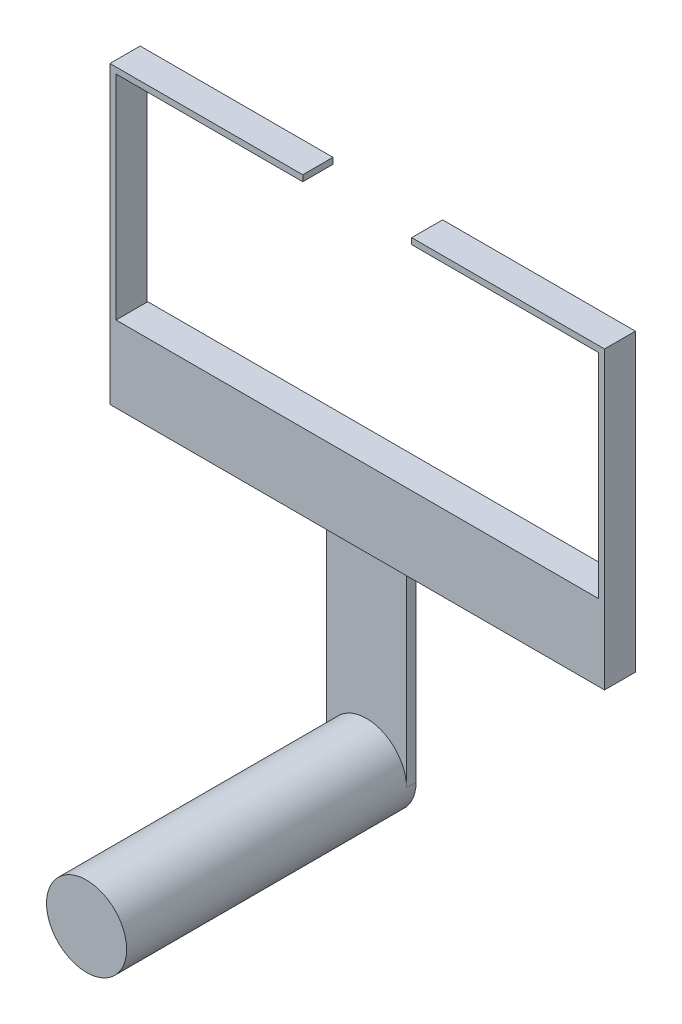
ISO-10303-21;
HEADER;
FILE_DESCRIPTION(('STEP AP214'),'2;1');
FILE_NAME('part.step','',(''),(''),'','','');
FILE_SCHEMA(('AUTOMOTIVE_DESIGN { 1 0 10303 214 1 1 1 1 }'));
ENDSEC;
DATA;
#1=APPLICATION_CONTEXT('core data for automotive mechanical design processes');
#2=APPLICATION_PROTOCOL_DEFINITION('international standard','automotive_design',2000,#1);
#3=PRODUCT_CONTEXT('',#1,'mechanical');
#4=PRODUCT('Part','Part','',(#3));
#5=PRODUCT_RELATED_PRODUCT_CATEGORY('part','',(#4));
#6=PRODUCT_DEFINITION_FORMATION('','',#4);
#7=PRODUCT_DEFINITION_CONTEXT('part definition',#1,'design');
#8=PRODUCT_DEFINITION('design','',#6,#7);
#9=PRODUCT_DEFINITION_SHAPE('','',#8);
#10=(LENGTH_UNIT() NAMED_UNIT(*) SI_UNIT(.MILLI.,.METRE.));
#11=(NAMED_UNIT(*) PLANE_ANGLE_UNIT() SI_UNIT($,.RADIAN.));
#12=(NAMED_UNIT(*) SI_UNIT($,.STERADIAN.) SOLID_ANGLE_UNIT());
#13=UNCERTAINTY_MEASURE_WITH_UNIT(LENGTH_MEASURE(1.E-05),#10,'distance_accuracy_value','');
#14=(GEOMETRIC_REPRESENTATION_CONTEXT(3) GLOBAL_UNCERTAINTY_ASSIGNED_CONTEXT((#13)) GLOBAL_UNIT_ASSIGNED_CONTEXT((#10,
#11,#12)) REPRESENTATION_CONTEXT('',''));
#15=CARTESIAN_POINT('',(0.,0.,0.));
#16=DIRECTION('',(0.,0.,1.));
#17=DIRECTION('',(1.,0.,0.));
#18=AXIS2_PLACEMENT_3D('',#15,#16,#17);
#19=CARTESIAN_POINT('',(0.,0.,-38.1));
#20=DIRECTION('',(0.,0.,1.));
#21=DIRECTION('',(1.,0.,0.));
#22=AXIS2_PLACEMENT_3D('',#19,#20,#21);
#23=CYLINDRICAL_SURFACE('',#22,5.27040746730455);
#24=DIRECTION('',(0.,0.,-1.));
#25=VECTOR('',#24,1.);
#26=CARTESIAN_POINT('',(5.27040746730455,0.,-36.8531804156065));
#27=LINE('',#26,#25);
#28=CARTESIAN_POINT('',(5.27040746730455,0.,-36.8531804156065));
#29=VERTEX_POINT('',#28);
#30=CARTESIAN_POINT('',(5.27040746730455,0.,-38.1));
#31=VERTEX_POINT('',#30);
#32=EDGE_CURVE('E406',#29,#31,#27,.T.);
#33=ORIENTED_EDGE('',*,*,#32,.F.);
#34=CARTESIAN_POINT('',(0.,0.,-36.8531804156065));
#35=DIRECTION('',(0.,0.,1.));
#36=DIRECTION('',(1.,0.,0.));
#37=AXIS2_PLACEMENT_3D('',#34,#35,#36);
#38=CIRCLE('',#37,5.27040746730455);
#39=CARTESIAN_POINT('',(-5.27040746730455,0.,-36.8531804156065));
#40=VERTEX_POINT('',#39);
#41=EDGE_CURVE('E79',#40,#29,#38,.F.);
#42=ORIENTED_EDGE('',*,*,#41,.F.);
#43=DIRECTION('',(0.,0.,-1.));
#44=VECTOR('',#43,1.);
#45=CARTESIAN_POINT('',(-5.27040746730455,0.,-36.8531804156065));
#46=LINE('',#45,#44);
#47=CARTESIAN_POINT('',(-5.27040746730455,0.,-38.1));
#48=VERTEX_POINT('',#47);
#49=EDGE_CURVE('E424',#40,#48,#46,.T.);
#50=ORIENTED_EDGE('',*,*,#49,.T.);
#51=CARTESIAN_POINT('',(0.,0.,-38.1));
#52=DIRECTION('',(0.,0.,1.));
#53=DIRECTION('',(1.,0.,0.));
#54=AXIS2_PLACEMENT_3D('',#51,#52,#53);
#55=CIRCLE('',#54,5.27040746730455);
#56=EDGE_CURVE('E431',#48,#31,#55,.T.);
#57=ORIENTED_EDGE('',*,*,#56,.T.);
#58=EDGE_LOOP('',(#33,#42,#50,#57));
#59=FACE_BOUND('',#58,.T.);
#60=CARTESIAN_POINT('',(0.,0.,0.));
#61=DIRECTION('',(0.,0.,1.));
#62=DIRECTION('',(1.,0.,0.));
#63=AXIS2_PLACEMENT_3D('',#60,#61,#62);
#64=CIRCLE('',#63,5.27040746730455);
#65=CARTESIAN_POINT('',(5.27040746730455,0.,0.));
#66=VERTEX_POINT('',#65);
#67=EDGE_CURVE('E423',#66,#66,#64,.T.);
#68=ORIENTED_EDGE('',*,*,#67,.F.);
#69=EDGE_LOOP('',(#68));
#70=FACE_BOUND('',#69,.T.);
#71=ADVANCED_FACE('F77',(#59,#70),#23,.T.);
#72=CARTESIAN_POINT('',(0.,0.,-38.1));
#73=DIRECTION('',(0.,0.,1.));
#74=DIRECTION('',(1.,0.,0.));
#75=AXIS2_PLACEMENT_3D('',#72,#73,#74);
#76=PLANE('',#75);
#77=ORIENTED_EDGE('',*,*,#56,.F.);
#78=DIRECTION('',(0.,1.,0.));
#79=VECTOR('',#78,1.);
#80=CARTESIAN_POINT('',(-5.27040746730455,0.,-38.1));
#81=LINE('',#80,#79);
#82=CARTESIAN_POINT('',(-5.27040746730455,25.4,-38.1));
#83=VERTEX_POINT('',#82);
#84=EDGE_CURVE('E412',#48,#83,#81,.T.);
#85=ORIENTED_EDGE('',*,*,#84,.T.);
#86=DIRECTION('',(1.,0.,0.));
#87=VECTOR('',#86,1.);
#88=CARTESIAN_POINT('',(5.27040746730455,25.4,-38.1));
#89=LINE('',#88,#87);
#90=CARTESIAN_POINT('',(5.27040746730455,25.4,-38.1));
#91=VERTEX_POINT('',#90);
#92=EDGE_CURVE('E400',#83,#91,#89,.T.);
#93=ORIENTED_EDGE('',*,*,#92,.T.);
#94=DIRECTION('',(0.,-1.,0.));
#95=VECTOR('',#94,1.);
#96=CARTESIAN_POINT('',(5.27040746730455,0.,-38.1));
#97=LINE('',#96,#95);
#98=EDGE_CURVE('E391',#91,#31,#97,.T.);
#99=ORIENTED_EDGE('',*,*,#98,.T.);
#100=EDGE_LOOP('',(#77,#85,#93,#99));
#101=FACE_BOUND('',#100,.T.);
#102=ADVANCED_FACE('F441',(#101),#76,.F.);
#103=CARTESIAN_POINT('',(0.,0.,0.));
#104=DIRECTION('',(0.,0.,1.));
#105=DIRECTION('',(1.,0.,0.));
#106=AXIS2_PLACEMENT_3D('',#103,#104,#105);
#107=PLANE('',#106);
#108=ORIENTED_EDGE('',*,*,#67,.T.);
#109=EDGE_LOOP('',(#108));
#110=FACE_BOUND('',#109,.T.);
#111=ADVANCED_FACE('F438',(#110),#107,.T.);
#112=CARTESIAN_POINT('',(5.27040746730455,0.,-36.8531804156065));
#113=DIRECTION('',(1.,0.,0.));
#114=DIRECTION('',(0.,0.,-1.));
#115=AXIS2_PLACEMENT_3D('',#112,#113,#114);
#116=PLANE('',#115);
#117=ORIENTED_EDGE('',*,*,#98,.F.);
#118=DIRECTION('',(0.,0.,-1.));
#119=VECTOR('',#118,1.);
#120=CARTESIAN_POINT('',(5.27040746730455,25.4,-36.8531804156065));
#121=LINE('',#120,#119);
#122=CARTESIAN_POINT('',(5.27040746730455,25.4,-36.8531804156065));
#123=VERTEX_POINT('',#122);
#124=EDGE_CURVE('E417',#123,#91,#121,.T.);
#125=ORIENTED_EDGE('',*,*,#124,.F.);
#126=DIRECTION('',(0.,-1.,0.));
#127=VECTOR('',#126,1.);
#128=CARTESIAN_POINT('',(5.27040746730455,0.,-36.8531804156065));
#129=LINE('',#128,#127);
#130=EDGE_CURVE('E393',#123,#29,#129,.T.);
#131=ORIENTED_EDGE('',*,*,#130,.T.);
#132=ORIENTED_EDGE('',*,*,#32,.T.);
#133=EDGE_LOOP('',(#117,#125,#131,#132));
#134=FACE_BOUND('',#133,.T.);
#135=ADVANCED_FACE('F458',(#134),#116,.T.);
#136=CARTESIAN_POINT('',(-5.27040746730455,0.,-36.8531804156065));
#137=DIRECTION('',(-1.,0.,0.));
#138=DIRECTION('',(0.,0.,1.));
#139=AXIS2_PLACEMENT_3D('',#136,#137,#138);
#140=PLANE('',#139);
#141=ORIENTED_EDGE('',*,*,#84,.F.);
#142=ORIENTED_EDGE('',*,*,#49,.F.);
#143=DIRECTION('',(0.,1.,0.));
#144=VECTOR('',#143,1.);
#145=CARTESIAN_POINT('',(-5.27040746730455,0.,-36.8531804156065));
#146=LINE('',#145,#144);
#147=CARTESIAN_POINT('',(-5.27040746730455,25.4,-36.8531804156065));
#148=VERTEX_POINT('',#147);
#149=EDGE_CURVE('E398',#40,#148,#146,.T.);
#150=ORIENTED_EDGE('',*,*,#149,.T.);
#151=DIRECTION('',(0.,0.,-1.));
#152=VECTOR('',#151,1.);
#153=CARTESIAN_POINT('',(-5.27040746730455,25.4,-36.8531804156065));
#154=LINE('',#153,#152);
#155=EDGE_CURVE('E422',#148,#83,#154,.T.);
#156=ORIENTED_EDGE('',*,*,#155,.T.);
#157=EDGE_LOOP('',(#141,#142,#150,#156));
#158=FACE_BOUND('',#157,.T.);
#159=ADVANCED_FACE('F466',(#158),#140,.T.);
#160=CARTESIAN_POINT('',(0.,0.,-36.8531804156065));
#161=DIRECTION('',(0.,0.,1.));
#162=DIRECTION('',(1.,0.,0.));
#163=AXIS2_PLACEMENT_3D('',#160,#161,#162);
#164=PLANE('',#163);
#165=ORIENTED_EDGE('',*,*,#149,.F.);
#166=ORIENTED_EDGE('',*,*,#41,.T.);
#167=ORIENTED_EDGE('',*,*,#130,.F.);
#168=DIRECTION('',(1.,0.,0.));
#169=VECTOR('',#168,1.);
#170=CARTESIAN_POINT('',(5.27040746730455,25.4,-36.8531804156065));
#171=LINE('',#170,#169);
#172=EDGE_CURVE('E401',#148,#123,#171,.T.);
#173=ORIENTED_EDGE('',*,*,#172,.F.);
#174=EDGE_LOOP('',(#165,#166,#167,#173));
#175=FACE_BOUND('',#174,.T.);
#176=ADVANCED_FACE('F460',(#175),#164,.T.);
#177=CARTESIAN_POINT('',(-31.75,35.427755954177,-35.6271272209921));
#178=DIRECTION('',(1.,0.,0.));
#179=DIRECTION('',(0.,0.,-1.));
#180=AXIS2_PLACEMENT_3D('',#177,#178,#179);
#181=PLANE('',#180);
#182=DIRECTION('',(0.,0.,1.));
#183=VECTOR('',#182,1.);
#184=CARTESIAN_POINT('',(-31.75,25.4,-35.6271272209921));
#185=LINE('',#184,#183);
#186=CARTESIAN_POINT('',(-31.75,25.4,-39.8007127790079));
#187=VERTEX_POINT('',#186);
#188=CARTESIAN_POINT('',(-31.75,25.4,-39.6911272209921));
#189=VERTEX_POINT('',#188);
#190=EDGE_CURVE('E329',#187,#189,#185,.T.);
#191=ORIENTED_EDGE('',*,*,#190,.T.);
#192=DIRECTION('',(0.,1.,0.));
#193=VECTOR('',#192,1.);
#194=CARTESIAN_POINT('',(-31.75,25.4,-39.6911272209921));
#195=LINE('',#194,#193);
#196=CARTESIAN_POINT('',(-31.75,35.427755954177,-39.6911272209921));
#197=VERTEX_POINT('',#196);
#198=EDGE_CURVE('E306',#189,#197,#195,.T.);
#199=ORIENTED_EDGE('',*,*,#198,.T.);
#200=DIRECTION('',(0.,0.,1.));
#201=VECTOR('',#200,1.);
#202=CARTESIAN_POINT('',(-31.75,35.427755954177,-35.6271272209921));
#203=LINE('',#202,#201);
#204=CARTESIAN_POINT('',(-31.75,35.427755954177,-39.8007127790079));
#205=VERTEX_POINT('',#204);
#206=EDGE_CURVE('E357',#205,#197,#203,.T.);
#207=ORIENTED_EDGE('',*,*,#206,.F.);
#208=DIRECTION('',(0.,-1.,0.));
#209=VECTOR('',#208,1.);
#210=CARTESIAN_POINT('',(-31.75,35.427755954177,-39.8007127790079));
#211=LINE('',#210,#209);
#212=EDGE_CURVE('E372',#205,#187,#211,.T.);
#213=ORIENTED_EDGE('',*,*,#212,.T.);
#214=EDGE_LOOP('',(#191,#199,#207,#213));
#215=FACE_BOUND('',#214,.T.);
#216=ADVANCED_FACE('F472',(#215),#181,.F.);
#217=CARTESIAN_POINT('',(31.75,35.427755954177,-35.6271272209921));
#218=DIRECTION('',(0.,0.,-1.));
#219=DIRECTION('',(-1.,0.,0.));
#220=AXIS2_PLACEMENT_3D('',#217,#218,#219);
#221=PLANE('',#220);
#222=DIRECTION('',(1.,0.,0.));
#223=VECTOR('',#222,1.);
#224=CARTESIAN_POINT('',(31.75,25.4,-35.6271272209921));
#225=LINE('',#224,#223);
#226=CARTESIAN_POINT('',(-32.5502280965126,25.4,-35.6271272209921));
#227=VERTEX_POINT('',#226);
#228=CARTESIAN_POINT('',(32.5502280965125,25.4,-35.6271272209921));
#229=VERTEX_POINT('',#228);
#230=EDGE_CURVE('E377',#227,#229,#225,.T.);
#231=ORIENTED_EDGE('',*,*,#230,.T.);
#232=DIRECTION('',(0.,1.,0.));
#233=VECTOR('',#232,1.);
#234=CARTESIAN_POINT('',(32.5502280965125,25.4,-35.6271272209921));
#235=LINE('',#234,#233);
#236=CARTESIAN_POINT('',(32.5502280965125,64.2748280965126,-35.6271272209921));
#237=VERTEX_POINT('',#236);
#238=EDGE_CURVE('E345',#229,#237,#235,.T.);
#239=ORIENTED_EDGE('',*,*,#238,.T.);
#240=DIRECTION('',(1.,0.,0.));
#241=VECTOR('',#240,1.);
#242=CARTESIAN_POINT('',(32.5502280965125,64.2748280965126,-35.6271272209921));
#243=LINE('',#242,#241);
#244=CARTESIAN_POINT('',(7.1705480965125,64.2748280965126,-35.6271272209921));
#245=VERTEX_POINT('',#244);
#246=EDGE_CURVE('E284',#245,#237,#243,.T.);
#247=ORIENTED_EDGE('',*,*,#246,.F.);
#248=DIRECTION('',(0.,-1.,0.));
#249=VECTOR('',#248,1.);
#250=CARTESIAN_POINT('',(7.1705480965125,64.2748280965126,-35.6271272209921));
#251=LINE('',#250,#249);
#252=CARTESIAN_POINT('',(7.1705480965125,63.4746,-35.6271272209921));
#253=VERTEX_POINT('',#252);
#254=EDGE_CURVE('E278',#245,#253,#251,.T.);
#255=ORIENTED_EDGE('',*,*,#254,.T.);
#256=DIRECTION('',(1.,0.,0.));
#257=VECTOR('',#256,1.);
#258=CARTESIAN_POINT('',(32.5502280965125,63.4746,-35.6271272209921));
#259=LINE('',#258,#257);
#260=CARTESIAN_POINT('',(31.75,63.4746,-35.6271272209921));
#261=VERTEX_POINT('',#260);
#262=EDGE_CURVE('E281',#253,#261,#259,.T.);
#263=ORIENTED_EDGE('',*,*,#262,.T.);
#264=DIRECTION('',(0.,-1.,0.));
#265=VECTOR('',#264,1.);
#266=CARTESIAN_POINT('',(31.75,25.4,-35.6271272209921));
#267=LINE('',#266,#265);
#268=CARTESIAN_POINT('',(31.75,35.427755954177,-35.6271272209921));
#269=VERTEX_POINT('',#268);
#270=EDGE_CURVE('E323',#261,#269,#267,.T.);
#271=ORIENTED_EDGE('',*,*,#270,.T.);
#272=DIRECTION('',(1.,0.,0.));
#273=VECTOR('',#272,1.);
#274=CARTESIAN_POINT('',(31.75,35.427755954177,-35.6271272209921));
#275=LINE('',#274,#273);
#276=CARTESIAN_POINT('',(-31.75,35.427755954177,-35.6271272209921));
#277=VERTEX_POINT('',#276);
#278=EDGE_CURVE('E363',#277,#269,#275,.T.);
#279=ORIENTED_EDGE('',*,*,#278,.F.);
#280=DIRECTION('',(0.,1.,0.));
#281=VECTOR('',#280,1.);
#282=CARTESIAN_POINT('',(-31.75,25.4,-35.6271272209921));
#283=LINE('',#282,#281);
#284=CARTESIAN_POINT('',(-31.75,63.4746,-35.6271272209921));
#285=VERTEX_POINT('',#284);
#286=EDGE_CURVE('E229',#277,#285,#283,.T.);
#287=ORIENTED_EDGE('',*,*,#286,.T.);
#288=DIRECTION('',(1.,0.,0.));
#289=VECTOR('',#288,1.);
#290=CARTESIAN_POINT('',(-32.5502280965126,63.4746,-35.6271272209921));
#291=LINE('',#290,#289);
#292=CARTESIAN_POINT('',(-7.17054809651258,63.4746,-35.6271272209921));
#293=VERTEX_POINT('',#292);
#294=EDGE_CURVE('E258',#285,#293,#291,.T.);
#295=ORIENTED_EDGE('',*,*,#294,.T.);
#296=DIRECTION('',(0.,-1.,0.));
#297=VECTOR('',#296,1.);
#298=CARTESIAN_POINT('',(-7.17054809651258,64.2748280965126,-35.6271272209921));
#299=LINE('',#298,#297);
#300=CARTESIAN_POINT('',(-7.17054809651258,64.2748280965126,-35.6271272209921));
#301=VERTEX_POINT('',#300);
#302=EDGE_CURVE('E236',#301,#293,#299,.T.);
#303=ORIENTED_EDGE('',*,*,#302,.F.);
#304=DIRECTION('',(1.,0.,0.));
#305=VECTOR('',#304,1.);
#306=CARTESIAN_POINT('',(-32.5502280965126,64.2748280965126,-35.6271272209921));
#307=LINE('',#306,#305);
#308=CARTESIAN_POINT('',(-32.5502280965126,64.2748280965126,-35.6271272209921));
#309=VERTEX_POINT('',#308);
#310=EDGE_CURVE('E231',#309,#301,#307,.T.);
#311=ORIENTED_EDGE('',*,*,#310,.F.);
#312=DIRECTION('',(0.,-1.,0.));
#313=VECTOR('',#312,1.);
#314=CARTESIAN_POINT('',(-32.5502280965126,25.4,-35.6271272209921));
#315=LINE('',#314,#313);
#316=EDGE_CURVE('E218',#309,#227,#315,.T.);
#317=ORIENTED_EDGE('',*,*,#316,.T.);
#318=EDGE_LOOP('',(#231,#239,#247,#255,#263,#271,#279,#287,#295,#303,#311,#317));
#319=FACE_BOUND('',#318,.T.);
#320=ADVANCED_FACE('F234',(#319),#221,.F.);
#321=CARTESIAN_POINT('',(31.75,35.427755954177,-35.6271272209921));
#322=DIRECTION('',(-1.,0.,0.));
#323=DIRECTION('',(0.,0.,1.));
#324=AXIS2_PLACEMENT_3D('',#321,#322,#323);
#325=PLANE('',#324);
#326=DIRECTION('',(0.,0.,-1.));
#327=VECTOR('',#326,1.);
#328=CARTESIAN_POINT('',(31.75,35.427755954177,-35.6271272209921));
#329=LINE('',#328,#327);
#330=CARTESIAN_POINT('',(31.75,35.427755954177,-39.6911272209921));
#331=VERTEX_POINT('',#330);
#332=CARTESIAN_POINT('',(31.75,35.427755954177,-39.8007127790079));
#333=VERTEX_POINT('',#332);
#334=EDGE_CURVE('E366',#331,#333,#329,.T.);
#335=ORIENTED_EDGE('',*,*,#334,.F.);
#336=DIRECTION('',(0.,-1.,0.));
#337=VECTOR('',#336,1.);
#338=CARTESIAN_POINT('',(31.75,25.4,-39.6911272209921));
#339=LINE('',#338,#337);
#340=CARTESIAN_POINT('',(31.75,25.4,-39.6911272209921));
#341=VERTEX_POINT('',#340);
#342=EDGE_CURVE('E12',#331,#341,#339,.T.);
#343=ORIENTED_EDGE('',*,*,#342,.T.);
#344=DIRECTION('',(0.,0.,-1.));
#345=VECTOR('',#344,1.);
#346=CARTESIAN_POINT('',(31.75,25.4,-35.6271272209921));
#347=LINE('',#346,#345);
#348=CARTESIAN_POINT('',(31.75,25.4,-39.8007127790079));
#349=VERTEX_POINT('',#348);
#350=EDGE_CURVE('E382',#341,#349,#347,.T.);
#351=ORIENTED_EDGE('',*,*,#350,.T.);
#352=DIRECTION('',(0.,-1.,0.));
#353=VECTOR('',#352,1.);
#354=CARTESIAN_POINT('',(31.75,35.427755954177,-39.8007127790079));
#355=LINE('',#354,#353);
#356=EDGE_CURVE('E387',#333,#349,#355,.T.);
#357=ORIENTED_EDGE('',*,*,#356,.F.);
#358=EDGE_LOOP('',(#335,#343,#351,#357));
#359=FACE_BOUND('',#358,.T.);
#360=ADVANCED_FACE('F526',(#359),#325,.F.);
#361=CARTESIAN_POINT('',(31.75,35.427755954177,-39.8007127790079));
#362=DIRECTION('',(0.,0.,1.));
#363=DIRECTION('',(1.,0.,0.));
#364=AXIS2_PLACEMENT_3D('',#361,#362,#363);
#365=PLANE('',#364);
#366=DIRECTION('',(-1.,0.,0.));
#367=VECTOR('',#366,1.);
#368=CARTESIAN_POINT('',(31.75,25.4,-39.8007127790079));
#369=LINE('',#368,#367);
#370=EDGE_CURVE('E381',#349,#187,#369,.T.);
#371=ORIENTED_EDGE('',*,*,#370,.T.);
#372=ORIENTED_EDGE('',*,*,#212,.F.);
#373=DIRECTION('',(-1.,0.,0.));
#374=VECTOR('',#373,1.);
#375=CARTESIAN_POINT('',(31.75,35.427755954177,-39.8007127790079));
#376=LINE('',#375,#374);
#377=EDGE_CURVE('E371',#333,#205,#376,.T.);
#378=ORIENTED_EDGE('',*,*,#377,.F.);
#379=ORIENTED_EDGE('',*,*,#356,.T.);
#380=EDGE_LOOP('',(#371,#372,#378,#379));
#381=FACE_BOUND('',#380,.T.);
#382=ADVANCED_FACE('F536',(#381),#365,.F.);
#383=CARTESIAN_POINT('',(0.,35.427755954177,0.));
#384=DIRECTION('',(0.,1.,0.));
#385=DIRECTION('',(0.,0.,1.));
#386=AXIS2_PLACEMENT_3D('',#383,#384,#385);
#387=PLANE('',#386);
#388=ORIENTED_EDGE('',*,*,#206,.T.);
#389=EDGE_CURVE('E365',#197,#277,#203,.T.);
#390=ORIENTED_EDGE('',*,*,#389,.T.);
#391=ORIENTED_EDGE('',*,*,#278,.T.);
#392=EDGE_CURVE('E370',#269,#331,#329,.T.);
#393=ORIENTED_EDGE('',*,*,#392,.T.);
#394=ORIENTED_EDGE('',*,*,#334,.T.);
#395=ORIENTED_EDGE('',*,*,#377,.T.);
#396=EDGE_LOOP('',(#388,#390,#391,#393,#394,#395));
#397=FACE_BOUND('',#396,.T.);
#398=ADVANCED_FACE('F547',(#397),#387,.T.);
#399=CARTESIAN_POINT('',(0.,25.4,0.));
#400=DIRECTION('',(0.,1.,0.));
#401=DIRECTION('',(0.,0.,1.));
#402=AXIS2_PLACEMENT_3D('',#399,#400,#401);
#403=PLANE('',#402);
#404=ORIENTED_EDGE('',*,*,#92,.F.);
#405=ORIENTED_EDGE('',*,*,#155,.F.);
#406=ORIENTED_EDGE('',*,*,#172,.T.);
#407=ORIENTED_EDGE('',*,*,#124,.T.);
#408=EDGE_LOOP('',(#404,#405,#406,#407));
#409=FACE_BOUND('',#408,.T.);
#410=ORIENTED_EDGE('',*,*,#190,.F.);
#411=ORIENTED_EDGE('',*,*,#370,.F.);
#412=ORIENTED_EDGE('',*,*,#350,.F.);
#413=DIRECTION('',(1.,0.,0.));
#414=VECTOR('',#413,1.);
#415=CARTESIAN_POINT('',(31.75,25.4,-39.6911272209921));
#416=LINE('',#415,#414);
#417=CARTESIAN_POINT('',(32.5502280965125,25.4,-39.6911272209921));
#418=VERTEX_POINT('',#417);
#419=EDGE_CURVE('E351',#341,#418,#416,.T.);
#420=ORIENTED_EDGE('',*,*,#419,.T.);
#421=DIRECTION('',(0.,0.,1.));
#422=VECTOR('',#421,1.);
#423=CARTESIAN_POINT('',(32.5502280965125,25.4,-39.6911272209921));
#424=LINE('',#423,#422);
#425=EDGE_CURVE('E333',#418,#229,#424,.T.);
#426=ORIENTED_EDGE('',*,*,#425,.T.);
#427=ORIENTED_EDGE('',*,*,#230,.F.);
#428=DIRECTION('',(0.,0.,1.));
#429=VECTOR('',#428,1.);
#430=CARTESIAN_POINT('',(-32.5502280965126,25.4,-39.6911272209921));
#431=LINE('',#430,#429);
#432=CARTESIAN_POINT('',(-32.5502280965126,25.4,-39.6911272209921));
#433=VERTEX_POINT('',#432);
#434=EDGE_CURVE('E227',#433,#227,#431,.T.);
#435=ORIENTED_EDGE('',*,*,#434,.F.);
#436=DIRECTION('',(1.,0.,0.));
#437=VECTOR('',#436,1.);
#438=CARTESIAN_POINT('',(-31.75,25.4,-39.6911272209921));
#439=LINE('',#438,#437);
#440=EDGE_CURVE('E320',#433,#189,#439,.T.);
#441=ORIENTED_EDGE('',*,*,#440,.T.);
#442=EDGE_LOOP('',(#410,#411,#412,#420,#426,#427,#435,#441));
#443=FACE_BOUND('',#442,.T.);
#444=ADVANCED_FACE('F464',(#409,#443),#403,.F.);
#445=CARTESIAN_POINT('',(31.75,25.4,-39.6911272209921));
#446=DIRECTION('',(-1.,0.,0.));
#447=DIRECTION('',(0.,0.,1.));
#448=AXIS2_PLACEMENT_3D('',#445,#446,#447);
#449=PLANE('',#448);
#450=ORIENTED_EDGE('',*,*,#392,.F.);
#451=ORIENTED_EDGE('',*,*,#270,.F.);
#452=DIRECTION('',(0.,0.,1.));
#453=VECTOR('',#452,1.);
#454=CARTESIAN_POINT('',(31.75,63.4746,-39.6911272209921));
#455=LINE('',#454,#453);
#456=CARTESIAN_POINT('',(31.75,63.4746,-39.6911272209921));
#457=VERTEX_POINT('',#456);
#458=EDGE_CURVE('E339',#457,#261,#455,.T.);
#459=ORIENTED_EDGE('',*,*,#458,.F.);
#460=EDGE_CURVE('E87',#457,#331,#339,.T.);
#461=ORIENTED_EDGE('',*,*,#460,.T.);
#462=EDGE_LOOP('',(#450,#451,#459,#461));
#463=FACE_BOUND('',#462,.T.);
#464=ADVANCED_FACE('F562',(#463),#449,.T.);
#465=CARTESIAN_POINT('',(32.5502280965125,25.4,-39.6911272209921));
#466=DIRECTION('',(1.,0.,0.));
#467=DIRECTION('',(0.,0.,-1.));
#468=AXIS2_PLACEMENT_3D('',#465,#466,#467);
#469=PLANE('',#468);
#470=ORIENTED_EDGE('',*,*,#238,.F.);
#471=ORIENTED_EDGE('',*,*,#425,.F.);
#472=DIRECTION('',(0.,1.,0.));
#473=VECTOR('',#472,1.);
#474=CARTESIAN_POINT('',(32.5502280965125,25.4,-39.6911272209921));
#475=LINE('',#474,#473);
#476=CARTESIAN_POINT('',(32.5502280965125,64.2748280965126,-39.6911272209921));
#477=VERTEX_POINT('',#476);
#478=EDGE_CURVE('E336',#418,#477,#475,.T.);
#479=ORIENTED_EDGE('',*,*,#478,.T.);
#480=DIRECTION('',(0.,0.,-1.));
#481=VECTOR('',#480,1.);
#482=CARTESIAN_POINT('',(32.5502280965125,64.2748280965126,-39.6911272209921));
#483=LINE('',#482,#481);
#484=EDGE_CURVE('E288',#237,#477,#483,.T.);
#485=ORIENTED_EDGE('',*,*,#484,.F.);
#486=EDGE_LOOP('',(#470,#471,#479,#485));
#487=FACE_BOUND('',#486,.T.);
#488=ADVANCED_FACE('F633',(#487),#469,.T.);
#489=CARTESIAN_POINT('',(0.,0.,-39.6911272209921));
#490=DIRECTION('',(0.,0.,-1.));
#491=DIRECTION('',(-1.,0.,0.));
#492=AXIS2_PLACEMENT_3D('',#489,#490,#491);
#493=PLANE('',#492);
#494=ORIENTED_EDGE('',*,*,#460,.F.);
#495=DIRECTION('',(-1.,0.,0.));
#496=VECTOR('',#495,1.);
#497=CARTESIAN_POINT('',(32.5502280965125,63.4746,-39.6911272209921));
#498=LINE('',#497,#496);
#499=CARTESIAN_POINT('',(7.1705480965125,63.4746,-39.6911272209921));
#500=VERTEX_POINT('',#499);
#501=EDGE_CURVE('E264',#457,#500,#498,.T.);
#502=ORIENTED_EDGE('',*,*,#501,.T.);
#503=DIRECTION('',(0.,-1.,0.));
#504=VECTOR('',#503,1.);
#505=CARTESIAN_POINT('',(7.1705480965125,64.2748280965126,-39.6911272209921));
#506=LINE('',#505,#504);
#507=CARTESIAN_POINT('',(7.1705480965125,64.2748280965126,-39.6911272209921));
#508=VERTEX_POINT('',#507);
#509=EDGE_CURVE('E273',#508,#500,#506,.T.);
#510=ORIENTED_EDGE('',*,*,#509,.F.);
#511=DIRECTION('',(-1.,0.,0.));
#512=VECTOR('',#511,1.);
#513=CARTESIAN_POINT('',(32.5502280965125,64.2748280965126,-39.6911272209921));
#514=LINE('',#513,#512);
#515=EDGE_CURVE('E297',#477,#508,#514,.T.);
#516=ORIENTED_EDGE('',*,*,#515,.F.);
#517=ORIENTED_EDGE('',*,*,#478,.F.);
#518=ORIENTED_EDGE('',*,*,#419,.F.);
#519=ORIENTED_EDGE('',*,*,#342,.F.);
#520=EDGE_LOOP('',(#494,#502,#510,#516,#517,#518,#519));
#521=FACE_BOUND('',#520,.T.);
#522=ADVANCED_FACE('F621',(#521),#493,.T.);
#523=CARTESIAN_POINT('',(-31.75,25.4,-39.6911272209921));
#524=DIRECTION('',(1.,0.,0.));
#525=DIRECTION('',(0.,0.,-1.));
#526=AXIS2_PLACEMENT_3D('',#523,#524,#525);
#527=PLANE('',#526);
#528=ORIENTED_EDGE('',*,*,#389,.F.);
#529=CARTESIAN_POINT('',(-31.75,63.4746,-39.6911272209921));
#530=VERTEX_POINT('',#529);
#531=EDGE_CURVE('E103',#197,#530,#195,.T.);
#532=ORIENTED_EDGE('',*,*,#531,.T.);
#533=DIRECTION('',(0.,0.,1.));
#534=VECTOR('',#533,1.);
#535=CARTESIAN_POINT('',(-31.75,63.4746,-39.6911272209921));
#536=LINE('',#535,#534);
#537=CARTESIAN_POINT('',(-31.75,63.4746,-39.6028220238804));
#538=VERTEX_POINT('',#537);
#539=EDGE_CURVE('E324',#530,#538,#536,.T.);
#540=ORIENTED_EDGE('',*,*,#539,.T.);
#541=EDGE_CURVE('E274',#538,#285,#536,.T.);
#542=ORIENTED_EDGE('',*,*,#541,.T.);
#543=ORIENTED_EDGE('',*,*,#286,.F.);
#544=EDGE_LOOP('',(#528,#532,#540,#542,#543));
#545=FACE_BOUND('',#544,.T.);
#546=ADVANCED_FACE('F611',(#545),#527,.T.);
#547=CARTESIAN_POINT('',(-32.5502280965126,25.4,-39.6911272209921));
#548=DIRECTION('',(-1.,0.,0.));
#549=DIRECTION('',(0.,0.,1.));
#550=AXIS2_PLACEMENT_3D('',#547,#548,#549);
#551=PLANE('',#550);
#552=ORIENTED_EDGE('',*,*,#316,.F.);
#553=DIRECTION('',(0.,0.,1.));
#554=VECTOR('',#553,1.);
#555=CARTESIAN_POINT('',(-32.5502280965126,64.2748280965126,-35.6271272209921));
#556=LINE('',#555,#554);
#557=CARTESIAN_POINT('',(-32.5502280965126,64.2748280965126,-39.6028220238804));
#558=VERTEX_POINT('',#557);
#559=EDGE_CURVE('E225',#558,#309,#556,.T.);
#560=ORIENTED_EDGE('',*,*,#559,.F.);
#561=DIRECTION('',(0.,-1.,0.));
#562=VECTOR('',#561,1.);
#563=CARTESIAN_POINT('',(-32.5502280965126,64.2748280965126,-39.6028220238804));
#564=LINE('',#563,#562);
#565=CARTESIAN_POINT('',(-32.5502280965126,63.4746,-39.6028220238804));
#566=VERTEX_POINT('',#565);
#567=EDGE_CURVE('E260',#558,#566,#564,.T.);
#568=ORIENTED_EDGE('',*,*,#567,.T.);
#569=DIRECTION('',(0.,0.,1.));
#570=VECTOR('',#569,1.);
#571=CARTESIAN_POINT('',(-32.5502280965126,63.4746,-39.6911272209921));
#572=LINE('',#571,#570);
#573=CARTESIAN_POINT('',(-32.5502280965126,63.4746,-39.6911272209921));
#574=VERTEX_POINT('',#573);
#575=EDGE_CURVE('E326',#574,#566,#572,.T.);
#576=ORIENTED_EDGE('',*,*,#575,.F.);
#577=DIRECTION('',(0.,-1.,0.));
#578=VECTOR('',#577,1.);
#579=CARTESIAN_POINT('',(-32.5502280965126,25.4,-39.6911272209921));
#580=LINE('',#579,#578);
#581=EDGE_CURVE('E313',#574,#433,#580,.T.);
#582=ORIENTED_EDGE('',*,*,#581,.T.);
#583=ORIENTED_EDGE('',*,*,#434,.T.);
#584=EDGE_LOOP('',(#552,#560,#568,#576,#582,#583));
#585=FACE_BOUND('',#584,.T.);
#586=ADVANCED_FACE('F222',(#585),#551,.T.);
#587=CARTESIAN_POINT('',(-31.75,63.4746,-39.6911272209921));
#588=DIRECTION('',(0.,1.,0.));
#589=DIRECTION('',(0.,0.,1.));
#590=AXIS2_PLACEMENT_3D('',#587,#588,#589);
#591=PLANE('',#590);
#592=DIRECTION('',(-1.,0.,0.));
#593=VECTOR('',#592,1.);
#594=CARTESIAN_POINT('',(-32.5502280965126,63.4746,-39.6028220238804));
#595=LINE('',#594,#593);
#596=EDGE_CURVE('E94',#538,#566,#595,.T.);
#597=ORIENTED_EDGE('',*,*,#596,.F.);
#598=ORIENTED_EDGE('',*,*,#539,.F.);
#599=DIRECTION('',(-1.,0.,0.));
#600=VECTOR('',#599,1.);
#601=CARTESIAN_POINT('',(-31.75,63.4746,-39.6911272209921));
#602=LINE('',#601,#600);
#603=EDGE_CURVE('E309',#530,#574,#602,.T.);
#604=ORIENTED_EDGE('',*,*,#603,.T.);
#605=ORIENTED_EDGE('',*,*,#575,.T.);
#606=EDGE_LOOP('',(#597,#598,#604,#605));
#607=FACE_BOUND('',#606,.T.);
#608=ADVANCED_FACE('F591',(#607),#591,.T.);
#609=CARTESIAN_POINT('',(0.,0.,-39.6911272209921));
#610=DIRECTION('',(0.,0.,1.));
#611=DIRECTION('',(1.,0.,0.));
#612=AXIS2_PLACEMENT_3D('',#609,#610,#611);
#613=PLANE('',#612);
#614=ORIENTED_EDGE('',*,*,#198,.F.);
#615=ORIENTED_EDGE('',*,*,#440,.F.);
#616=ORIENTED_EDGE('',*,*,#581,.F.);
#617=ORIENTED_EDGE('',*,*,#603,.F.);
#618=ORIENTED_EDGE('',*,*,#531,.F.);
#619=EDGE_LOOP('',(#614,#615,#616,#617,#618));
#620=FACE_BOUND('',#619,.T.);
#621=ADVANCED_FACE('F583',(#620),#613,.F.);
#622=CARTESIAN_POINT('',(0.,63.4746,0.));
#623=DIRECTION('',(0.,-1.,0.));
#624=DIRECTION('',(0.,0.,-1.));
#625=AXIS2_PLACEMENT_3D('',#622,#623,#624);
#626=PLANE('',#625);
#627=ORIENTED_EDGE('',*,*,#541,.F.);
#628=CARTESIAN_POINT('',(-7.17054809651258,63.4746,-39.6028220238804));
#629=VERTEX_POINT('',#628);
#630=EDGE_CURVE('E250',#629,#538,#595,.T.);
#631=ORIENTED_EDGE('',*,*,#630,.F.);
#632=DIRECTION('',(0.,0.,-1.));
#633=VECTOR('',#632,1.);
#634=CARTESIAN_POINT('',(-7.17054809651258,63.4746,-35.6271272209921));
#635=LINE('',#634,#633);
#636=EDGE_CURVE('E265',#293,#629,#635,.T.);
#637=ORIENTED_EDGE('',*,*,#636,.F.);
#638=ORIENTED_EDGE('',*,*,#294,.F.);
#639=EDGE_LOOP('',(#627,#631,#637,#638));
#640=FACE_BOUND('',#639,.T.);
#641=ADVANCED_FACE('F588',(#640),#626,.T.);
#642=CARTESIAN_POINT('',(-7.17054809651258,64.2748280965126,-35.6271272209921));
#643=DIRECTION('',(-1.,0.,0.));
#644=DIRECTION('',(0.,0.,1.));
#645=AXIS2_PLACEMENT_3D('',#642,#643,#644);
#646=PLANE('',#645);
#647=ORIENTED_EDGE('',*,*,#636,.T.);
#648=DIRECTION('',(0.,-1.,0.));
#649=VECTOR('',#648,1.);
#650=CARTESIAN_POINT('',(-7.17054809651258,64.2748280965126,-39.6028220238804));
#651=LINE('',#650,#649);
#652=CARTESIAN_POINT('',(-7.17054809651258,64.2748280965126,-39.6028220238804));
#653=VERTEX_POINT('',#652);
#654=EDGE_CURVE('E269',#653,#629,#651,.T.);
#655=ORIENTED_EDGE('',*,*,#654,.F.);
#656=DIRECTION('',(0.,0.,-1.));
#657=VECTOR('',#656,1.);
#658=CARTESIAN_POINT('',(-7.17054809651258,64.2748280965126,-35.6271272209921));
#659=LINE('',#658,#657);
#660=EDGE_CURVE('E239',#301,#653,#659,.T.);
#661=ORIENTED_EDGE('',*,*,#660,.F.);
#662=ORIENTED_EDGE('',*,*,#302,.T.);
#663=EDGE_LOOP('',(#647,#655,#661,#662));
#664=FACE_BOUND('',#663,.T.);
#665=ADVANCED_FACE('F672',(#664),#646,.F.);
#666=CARTESIAN_POINT('',(-32.5502280965126,64.2748280965126,-39.6028220238804));
#667=DIRECTION('',(0.,0.,1.));
#668=DIRECTION('',(1.,0.,0.));
#669=AXIS2_PLACEMENT_3D('',#666,#667,#668);
#670=PLANE('',#669);
#671=ORIENTED_EDGE('',*,*,#630,.T.);
#672=ORIENTED_EDGE('',*,*,#596,.T.);
#673=ORIENTED_EDGE('',*,*,#567,.F.);
#674=DIRECTION('',(-1.,0.,0.));
#675=VECTOR('',#674,1.);
#676=CARTESIAN_POINT('',(-32.5502280965126,64.2748280965126,-39.6028220238804));
#677=LINE('',#676,#675);
#678=EDGE_CURVE('E242',#653,#558,#677,.T.);
#679=ORIENTED_EDGE('',*,*,#678,.F.);
#680=ORIENTED_EDGE('',*,*,#654,.T.);
#681=EDGE_LOOP('',(#671,#672,#673,#679,#680));
#682=FACE_BOUND('',#681,.T.);
#683=ADVANCED_FACE('F671',(#682),#670,.F.);
#684=CARTESIAN_POINT('',(0.,64.2748280965126,0.));
#685=DIRECTION('',(0.,-1.,0.));
#686=DIRECTION('',(0.,0.,-1.));
#687=AXIS2_PLACEMENT_3D('',#684,#685,#686);
#688=PLANE('',#687);
#689=ORIENTED_EDGE('',*,*,#559,.T.);
#690=ORIENTED_EDGE('',*,*,#310,.T.);
#691=ORIENTED_EDGE('',*,*,#660,.T.);
#692=ORIENTED_EDGE('',*,*,#678,.T.);
#693=EDGE_LOOP('',(#689,#690,#691,#692));
#694=FACE_BOUND('',#693,.T.);
#695=ADVANCED_FACE('F245',(#694),#688,.F.);
#696=CARTESIAN_POINT('',(7.1705480965125,64.2748280965126,-39.6911272209921));
#697=DIRECTION('',(1.,0.,0.));
#698=DIRECTION('',(0.,0.,-1.));
#699=AXIS2_PLACEMENT_3D('',#696,#697,#698);
#700=PLANE('',#699);
#701=DIRECTION('',(0.,0.,1.));
#702=VECTOR('',#701,1.);
#703=CARTESIAN_POINT('',(7.1705480965125,63.4746,-39.6911272209921));
#704=LINE('',#703,#702);
#705=EDGE_CURVE('E289',#500,#253,#704,.T.);
#706=ORIENTED_EDGE('',*,*,#705,.T.);
#707=ORIENTED_EDGE('',*,*,#254,.F.);
#708=DIRECTION('',(0.,0.,1.));
#709=VECTOR('',#708,1.);
#710=CARTESIAN_POINT('',(7.1705480965125,64.2748280965126,-39.6911272209921));
#711=LINE('',#710,#709);
#712=EDGE_CURVE('E300',#508,#245,#711,.T.);
#713=ORIENTED_EDGE('',*,*,#712,.F.);
#714=ORIENTED_EDGE('',*,*,#509,.T.);
#715=EDGE_LOOP('',(#706,#707,#713,#714));
#716=FACE_BOUND('',#715,.T.);
#717=ADVANCED_FACE('F661',(#716),#700,.F.);
#718=CARTESIAN_POINT('',(0.,64.2748280965126,0.));
#719=DIRECTION('',(0.,-1.,0.));
#720=DIRECTION('',(0.,0.,-1.));
#721=AXIS2_PLACEMENT_3D('',#718,#719,#720);
#722=PLANE('',#721);
#723=ORIENTED_EDGE('',*,*,#484,.T.);
#724=ORIENTED_EDGE('',*,*,#515,.T.);
#725=ORIENTED_EDGE('',*,*,#712,.T.);
#726=ORIENTED_EDGE('',*,*,#246,.T.);
#727=EDGE_LOOP('',(#723,#724,#725,#726));
#728=FACE_BOUND('',#727,.T.);
#729=ADVANCED_FACE('F658',(#728),#722,.F.);
#730=CARTESIAN_POINT('',(0.,63.4746,0.));
#731=DIRECTION('',(0.,-1.,0.));
#732=DIRECTION('',(0.,0.,-1.));
#733=AXIS2_PLACEMENT_3D('',#730,#731,#732);
#734=PLANE('',#733);
#735=ORIENTED_EDGE('',*,*,#501,.F.);
#736=ORIENTED_EDGE('',*,*,#458,.T.);
#737=ORIENTED_EDGE('',*,*,#262,.F.);
#738=ORIENTED_EDGE('',*,*,#705,.F.);
#739=EDGE_LOOP('',(#735,#736,#737,#738));
#740=FACE_BOUND('',#739,.T.);
#741=ADVANCED_FACE('F665',(#740),#734,.T.);
#742=CLOSED_SHELL('',(#71,#102,#111,#135,#159,#176,#216,#320,#360,#382,#398,#444,#464,#488,#522,
#546,#586,#608,#621,#641,#665,#683,#695,#717,#729,#741));
#743=MANIFOLD_SOLID_BREP('B2',#742);
#744=ADVANCED_BREP_SHAPE_REPRESENTATION('',(#18,#743),#14);
#745=SHAPE_DEFINITION_REPRESENTATION(#9,#744);
ENDSEC;
END-ISO-10303-21;
